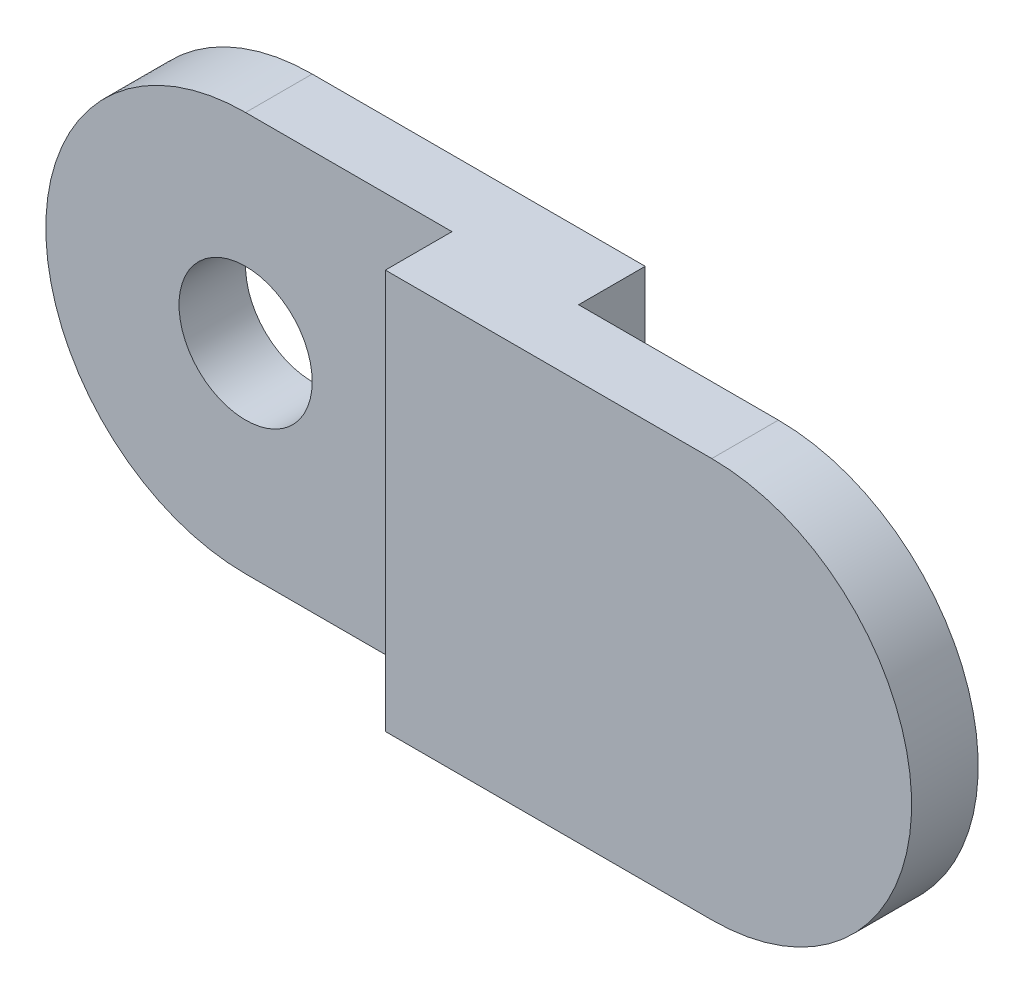
ISO-10303-21;
HEADER;
FILE_DESCRIPTION(('STEP AP214'),'2;1');
FILE_NAME('part.step','',(''),(''),'','','');
FILE_SCHEMA(('AUTOMOTIVE_DESIGN { 1 0 10303 214 1 1 1 1 }'));
ENDSEC;
DATA;
#1=APPLICATION_CONTEXT('core data for automotive mechanical design processes');
#2=APPLICATION_PROTOCOL_DEFINITION('international standard','automotive_design',2000,#1);
#3=PRODUCT_CONTEXT('',#1,'mechanical');
#4=PRODUCT('Part','Part','',(#3));
#5=PRODUCT_RELATED_PRODUCT_CATEGORY('part','',(#4));
#6=PRODUCT_DEFINITION_FORMATION('','',#4);
#7=PRODUCT_DEFINITION_CONTEXT('part definition',#1,'design');
#8=PRODUCT_DEFINITION('design','',#6,#7);
#9=PRODUCT_DEFINITION_SHAPE('','',#8);
#10=(LENGTH_UNIT() NAMED_UNIT(*) SI_UNIT(.MILLI.,.METRE.));
#11=(NAMED_UNIT(*) PLANE_ANGLE_UNIT() SI_UNIT($,.RADIAN.));
#12=(NAMED_UNIT(*) SI_UNIT($,.STERADIAN.) SOLID_ANGLE_UNIT());
#13=UNCERTAINTY_MEASURE_WITH_UNIT(LENGTH_MEASURE(1.E-05),#10,'distance_accuracy_value','');
#14=(GEOMETRIC_REPRESENTATION_CONTEXT(3) GLOBAL_UNCERTAINTY_ASSIGNED_CONTEXT((#13)) GLOBAL_UNIT_ASSIGNED_CONTEXT((#10,
#11,#12)) REPRESENTATION_CONTEXT('',''));
#15=CARTESIAN_POINT('',(0.,0.,0.));
#16=DIRECTION('',(0.,0.,1.));
#17=DIRECTION('',(1.,0.,0.));
#18=AXIS2_PLACEMENT_3D('',#15,#16,#17);
#19=CARTESIAN_POINT('',(20.,7.5,2.5));
#20=DIRECTION('',(0.,0.,-1.));
#21=DIRECTION('',(-1.,0.,0.));
#22=AXIS2_PLACEMENT_3D('',#19,#20,#21);
#23=PLANE('',#22);
#24=DIRECTION('',(0.,1.,0.));
#25=VECTOR('',#24,1.);
#26=CARTESIAN_POINT('',(12.5,15.,2.5));
#27=LINE('',#26,#25);
#28=CARTESIAN_POINT('',(12.5,0.,2.5));
#29=VERTEX_POINT('',#28);
#30=CARTESIAN_POINT('',(12.5,15.,2.5));
#31=VERTEX_POINT('',#30);
#32=EDGE_CURVE('E130',#29,#31,#27,.T.);
#33=ORIENTED_EDGE('',*,*,#32,.T.);
#34=DIRECTION('',(1.,0.,0.));
#35=VECTOR('',#34,1.);
#36=CARTESIAN_POINT('',(20.,15.,2.5));
#37=LINE('',#36,#35);
#38=CARTESIAN_POINT('',(20.,15.,2.5));
#39=VERTEX_POINT('',#38);
#40=EDGE_CURVE('E133',#31,#39,#37,.T.);
#41=ORIENTED_EDGE('',*,*,#40,.T.);
#42=CARTESIAN_POINT('',(20.,7.5,2.5));
#43=DIRECTION('',(0.,0.,-1.));
#44=DIRECTION('',(-1.,0.,0.));
#45=AXIS2_PLACEMENT_3D('',#42,#43,#44);
#46=CIRCLE('',#45,7.5);
#47=CARTESIAN_POINT('',(20.,0.,2.5));
#48=VERTEX_POINT('',#47);
#49=EDGE_CURVE('E135',#39,#48,#46,.T.);
#50=ORIENTED_EDGE('',*,*,#49,.T.);
#51=DIRECTION('',(-1.,0.,0.));
#52=VECTOR('',#51,1.);
#53=CARTESIAN_POINT('',(20.,0.,2.5));
#54=LINE('',#53,#52);
#55=EDGE_CURVE('E137',#48,#29,#54,.T.);
#56=ORIENTED_EDGE('',*,*,#55,.T.);
#57=EDGE_LOOP('',(#33,#41,#50,#56));
#58=FACE_BOUND('',#57,.T.);
#59=CARTESIAN_POINT('',(20.,7.5,2.5));
#60=DIRECTION('',(0.,0.,-1.));
#61=DIRECTION('',(-1.,0.,0.));
#62=AXIS2_PLACEMENT_3D('',#59,#60,#61);
#63=CIRCLE('',#62,2.5);
#64=CARTESIAN_POINT('',(17.5,7.5,2.5));
#65=VERTEX_POINT('',#64);
#66=EDGE_CURVE('E287',#65,#65,#63,.T.);
#67=ORIENTED_EDGE('',*,*,#66,.F.);
#68=EDGE_LOOP('',(#67));
#69=FACE_BOUND('',#68,.T.);
#70=ADVANCED_FACE('F37',(#58,#69),#23,.T.);
#71=CARTESIAN_POINT('',(0.,15.,5.));
#72=DIRECTION('',(0.,1.,0.));
#73=DIRECTION('',(-1.,0.,0.));
#74=AXIS2_PLACEMENT_3D('',#71,#72,#73);
#75=PLANE('',#74);
#76=DIRECTION('',(-1.,0.,0.));
#77=VECTOR('',#76,1.);
#78=CARTESIAN_POINT('',(0.,15.,2.5));
#79=LINE('',#78,#77);
#80=CARTESIAN_POINT('',(7.74683287137634,15.,2.5));
#81=VERTEX_POINT('',#80);
#82=CARTESIAN_POINT('',(0.,15.,2.5));
#83=VERTEX_POINT('',#82);
#84=EDGE_CURVE('E113',#81,#83,#79,.T.);
#85=ORIENTED_EDGE('',*,*,#84,.F.);
#86=DIRECTION('',(0.,0.,1.));
#87=VECTOR('',#86,1.);
#88=CARTESIAN_POINT('',(7.74683287137634,15.,2.5));
#89=LINE('',#88,#87);
#90=CARTESIAN_POINT('',(7.74683287137634,15.,5.));
#91=VERTEX_POINT('',#90);
#92=EDGE_CURVE('E100',#81,#91,#89,.T.);
#93=ORIENTED_EDGE('',*,*,#92,.T.);
#94=DIRECTION('',(1.,0.,0.));
#95=VECTOR('',#94,1.);
#96=CARTESIAN_POINT('',(0.,15.,5.));
#97=LINE('',#96,#95);
#98=CARTESIAN_POINT('',(20.,15.,5.));
#99=VERTEX_POINT('',#98);
#100=EDGE_CURVE('E149',#91,#99,#97,.T.);
#101=ORIENTED_EDGE('',*,*,#100,.T.);
#102=DIRECTION('',(0.,0.,-1.));
#103=VECTOR('',#102,1.);
#104=CARTESIAN_POINT('',(20.,15.,5.));
#105=LINE('',#104,#103);
#106=EDGE_CURVE('E11',#99,#39,#105,.T.);
#107=ORIENTED_EDGE('',*,*,#106,.T.);
#108=ORIENTED_EDGE('',*,*,#40,.F.);
#109=DIRECTION('',(0.,0.,-1.));
#110=VECTOR('',#109,1.);
#111=CARTESIAN_POINT('',(12.5,15.,2.5));
#112=LINE('',#111,#110);
#113=CARTESIAN_POINT('',(12.5,15.,0.));
#114=VERTEX_POINT('',#113);
#115=EDGE_CURVE('E140',#31,#114,#112,.T.);
#116=ORIENTED_EDGE('',*,*,#115,.T.);
#117=DIRECTION('',(1.,0.,0.));
#118=VECTOR('',#117,1.);
#119=CARTESIAN_POINT('',(0.,15.,0.));
#120=LINE('',#119,#118);
#121=CARTESIAN_POINT('',(0.,15.,0.));
#122=VERTEX_POINT('',#121);
#123=EDGE_CURVE('E143',#122,#114,#120,.T.);
#124=ORIENTED_EDGE('',*,*,#123,.F.);
#125=DIRECTION('',(0.,0.,-1.));
#126=VECTOR('',#125,1.);
#127=CARTESIAN_POINT('',(0.,15.,5.));
#128=LINE('',#127,#126);
#129=EDGE_CURVE('E45',#83,#122,#128,.T.);
#130=ORIENTED_EDGE('',*,*,#129,.F.);
#131=EDGE_LOOP('',(#85,#93,#101,#107,#108,#116,#124,#130));
#132=FACE_BOUND('',#131,.T.);
#133=ADVANCED_FACE('F118',(#132),#75,.T.);
#134=CARTESIAN_POINT('',(0.,7.50000000000001,5.));
#135=DIRECTION('',(0.,0.,-1.));
#136=DIRECTION('',(-1.,0.,0.));
#137=AXIS2_PLACEMENT_3D('',#134,#135,#136);
#138=CYLINDRICAL_SURFACE('',#137,7.50000000000001);
#139=CARTESIAN_POINT('',(0.,7.50000000000001,2.5));
#140=DIRECTION('',(0.,0.,1.));
#141=DIRECTION('',(1.,0.,0.));
#142=AXIS2_PLACEMENT_3D('',#139,#140,#141);
#143=CIRCLE('',#142,7.50000000000001);
#144=CARTESIAN_POINT('',(0.,0.,2.5));
#145=VERTEX_POINT('',#144);
#146=EDGE_CURVE('E120',#83,#145,#143,.T.);
#147=ORIENTED_EDGE('',*,*,#146,.F.);
#148=ORIENTED_EDGE('',*,*,#129,.T.);
#149=CARTESIAN_POINT('',(0.,7.50000000000001,0.));
#150=DIRECTION('',(0.,0.,1.));
#151=DIRECTION('',(1.,0.,0.));
#152=AXIS2_PLACEMENT_3D('',#149,#150,#151);
#153=CIRCLE('',#152,7.50000000000001);
#154=CARTESIAN_POINT('',(0.,0.,0.));
#155=VERTEX_POINT('',#154);
#156=EDGE_CURVE('E157',#122,#155,#153,.T.);
#157=ORIENTED_EDGE('',*,*,#156,.T.);
#158=DIRECTION('',(0.,0.,-1.));
#159=VECTOR('',#158,1.);
#160=CARTESIAN_POINT('',(0.,0.,5.));
#161=LINE('',#160,#159);
#162=EDGE_CURVE('E164',#145,#155,#161,.T.);
#163=ORIENTED_EDGE('',*,*,#162,.F.);
#164=EDGE_LOOP('',(#147,#148,#157,#163));
#165=FACE_BOUND('',#164,.T.);
#166=ADVANCED_FACE('F167',(#165),#138,.T.);
#167=CARTESIAN_POINT('',(0.,0.,5.));
#168=DIRECTION('',(0.,1.,0.));
#169=DIRECTION('',(0.,0.,1.));
#170=AXIS2_PLACEMENT_3D('',#167,#168,#169);
#171=PLANE('',#170);
#172=DIRECTION('',(0.,0.,1.));
#173=VECTOR('',#172,1.);
#174=CARTESIAN_POINT('',(7.74683287137634,0.,2.5));
#175=LINE('',#174,#173);
#176=CARTESIAN_POINT('',(7.74683287137634,0.,2.5));
#177=VERTEX_POINT('',#176);
#178=CARTESIAN_POINT('',(7.74683287137634,0.,5.));
#179=VERTEX_POINT('',#178);
#180=EDGE_CURVE('E52',#177,#179,#175,.T.);
#181=ORIENTED_EDGE('',*,*,#180,.F.);
#182=DIRECTION('',(1.,0.,0.));
#183=VECTOR('',#182,1.);
#184=CARTESIAN_POINT('',(0.,0.,2.5));
#185=LINE('',#184,#183);
#186=EDGE_CURVE('E109',#145,#177,#185,.T.);
#187=ORIENTED_EDGE('',*,*,#186,.F.);
#188=ORIENTED_EDGE('',*,*,#162,.T.);
#189=DIRECTION('',(1.,0.,0.));
#190=VECTOR('',#189,1.);
#191=CARTESIAN_POINT('',(0.,0.,0.));
#192=LINE('',#191,#190);
#193=CARTESIAN_POINT('',(12.5,0.,0.));
#194=VERTEX_POINT('',#193);
#195=EDGE_CURVE('E150',#155,#194,#192,.T.);
#196=ORIENTED_EDGE('',*,*,#195,.T.);
#197=DIRECTION('',(0.,0.,-1.));
#198=VECTOR('',#197,1.);
#199=CARTESIAN_POINT('',(12.5,0.,2.5));
#200=LINE('',#199,#198);
#201=EDGE_CURVE('E60',#29,#194,#200,.T.);
#202=ORIENTED_EDGE('',*,*,#201,.F.);
#203=ORIENTED_EDGE('',*,*,#55,.F.);
#204=DIRECTION('',(0.,0.,-1.));
#205=VECTOR('',#204,1.);
#206=CARTESIAN_POINT('',(20.,0.,5.));
#207=LINE('',#206,#205);
#208=CARTESIAN_POINT('',(20.,0.,5.));
#209=VERTEX_POINT('',#208);
#210=EDGE_CURVE('E154',#209,#48,#207,.T.);
#211=ORIENTED_EDGE('',*,*,#210,.F.);
#212=DIRECTION('',(1.,0.,0.));
#213=VECTOR('',#212,1.);
#214=CARTESIAN_POINT('',(0.,0.,5.));
#215=LINE('',#214,#213);
#216=EDGE_CURVE('E152',#179,#209,#215,.T.);
#217=ORIENTED_EDGE('',*,*,#216,.F.);
#218=EDGE_LOOP('',(#181,#187,#188,#196,#202,#203,#211,#217));
#219=FACE_BOUND('',#218,.T.);
#220=ADVANCED_FACE('F180',(#219),#171,.F.);
#221=CARTESIAN_POINT('',(0.,0.,5.));
#222=DIRECTION('',(0.,0.,1.));
#223=DIRECTION('',(1.,0.,0.));
#224=AXIS2_PLACEMENT_3D('',#221,#222,#223);
#225=PLANE('',#224);
#226=ORIENTED_EDGE('',*,*,#100,.F.);
#227=DIRECTION('',(0.,-1.,0.));
#228=VECTOR('',#227,1.);
#229=CARTESIAN_POINT('',(7.74683287137634,0.,5.));
#230=LINE('',#229,#228);
#231=EDGE_CURVE('E105',#91,#179,#230,.T.);
#232=ORIENTED_EDGE('',*,*,#231,.T.);
#233=ORIENTED_EDGE('',*,*,#216,.T.);
#234=CARTESIAN_POINT('',(20.,7.5,5.));
#235=DIRECTION('',(0.,0.,1.));
#236=DIRECTION('',(1.,0.,0.));
#237=AXIS2_PLACEMENT_3D('',#234,#235,#236);
#238=CIRCLE('',#237,7.5);
#239=EDGE_CURVE('E146',#99,#209,#238,.F.);
#240=ORIENTED_EDGE('',*,*,#239,.F.);
#241=EDGE_LOOP('',(#226,#232,#233,#240));
#242=FACE_BOUND('',#241,.T.);
#243=ADVANCED_FACE('F184',(#242),#225,.T.);
#244=CARTESIAN_POINT('',(20.,7.5,5.));
#245=DIRECTION('',(0.,0.,-1.));
#246=DIRECTION('',(-1.,0.,0.));
#247=AXIS2_PLACEMENT_3D('',#244,#245,#246);
#248=CYLINDRICAL_SURFACE('',#247,7.5);
#249=ORIENTED_EDGE('',*,*,#210,.T.);
#250=ORIENTED_EDGE('',*,*,#49,.F.);
#251=ORIENTED_EDGE('',*,*,#106,.F.);
#252=ORIENTED_EDGE('',*,*,#239,.T.);
#253=EDGE_LOOP('',(#249,#250,#251,#252));
#254=FACE_BOUND('',#253,.T.);
#255=ADVANCED_FACE('F39',(#254),#248,.T.);
#256=CARTESIAN_POINT('',(0.,0.,0.));
#257=DIRECTION('',(0.,0.,1.));
#258=DIRECTION('',(1.,0.,0.));
#259=AXIS2_PLACEMENT_3D('',#256,#257,#258);
#260=PLANE('',#259);
#261=CARTESIAN_POINT('',(0.,7.50000000000001,0.));
#262=DIRECTION('',(0.,0.,1.));
#263=DIRECTION('',(1.,0.,0.));
#264=AXIS2_PLACEMENT_3D('',#261,#262,#263);
#265=CIRCLE('',#264,2.5);
#266=CARTESIAN_POINT('',(2.5,7.50000000000001,0.));
#267=VERTEX_POINT('',#266);
#268=EDGE_CURVE('E127',#267,#267,#265,.T.);
#269=ORIENTED_EDGE('',*,*,#268,.T.);
#270=EDGE_LOOP('',(#269));
#271=FACE_BOUND('',#270,.T.);
#272=ORIENTED_EDGE('',*,*,#123,.T.);
#273=DIRECTION('',(0.,1.,0.));
#274=VECTOR('',#273,1.);
#275=CARTESIAN_POINT('',(12.5,15.,0.));
#276=LINE('',#275,#274);
#277=EDGE_CURVE('E128',#194,#114,#276,.T.);
#278=ORIENTED_EDGE('',*,*,#277,.F.);
#279=ORIENTED_EDGE('',*,*,#195,.F.);
#280=ORIENTED_EDGE('',*,*,#156,.F.);
#281=EDGE_LOOP('',(#272,#278,#279,#280));
#282=FACE_BOUND('',#281,.T.);
#283=ADVANCED_FACE('F171',(#271,#282),#260,.F.);
#284=CARTESIAN_POINT('',(12.5,15.,2.5));
#285=DIRECTION('',(-1.,0.,0.));
#286=DIRECTION('',(0.,-1.,0.));
#287=AXIS2_PLACEMENT_3D('',#284,#285,#286);
#288=PLANE('',#287);
#289=ORIENTED_EDGE('',*,*,#277,.T.);
#290=ORIENTED_EDGE('',*,*,#115,.F.);
#291=ORIENTED_EDGE('',*,*,#32,.F.);
#292=ORIENTED_EDGE('',*,*,#201,.T.);
#293=EDGE_LOOP('',(#289,#290,#291,#292));
#294=FACE_BOUND('',#293,.T.);
#295=ADVANCED_FACE('F173',(#294),#288,.F.);
#296=CARTESIAN_POINT('',(7.74683287137634,0.,2.5));
#297=DIRECTION('',(-1.,0.,0.));
#298=DIRECTION('',(0.,0.,1.));
#299=AXIS2_PLACEMENT_3D('',#296,#297,#298);
#300=PLANE('',#299);
#301=ORIENTED_EDGE('',*,*,#231,.F.);
#302=ORIENTED_EDGE('',*,*,#92,.F.);
#303=DIRECTION('',(0.,-1.,0.));
#304=VECTOR('',#303,1.);
#305=CARTESIAN_POINT('',(7.74683287137634,0.,2.5));
#306=LINE('',#305,#304);
#307=EDGE_CURVE('E103',#81,#177,#306,.T.);
#308=ORIENTED_EDGE('',*,*,#307,.T.);
#309=ORIENTED_EDGE('',*,*,#180,.T.);
#310=EDGE_LOOP('',(#301,#302,#308,#309));
#311=FACE_BOUND('',#310,.T.);
#312=ADVANCED_FACE('F102',(#311),#300,.T.);
#313=CARTESIAN_POINT('',(0.,0.,2.5));
#314=DIRECTION('',(0.,0.,1.));
#315=DIRECTION('',(1.,0.,0.));
#316=AXIS2_PLACEMENT_3D('',#313,#314,#315);
#317=PLANE('',#316);
#318=CARTESIAN_POINT('',(0.,7.50000000000001,2.5));
#319=DIRECTION('',(0.,0.,1.));
#320=DIRECTION('',(1.,0.,0.));
#321=AXIS2_PLACEMENT_3D('',#318,#319,#320);
#322=CIRCLE('',#321,2.5);
#323=CARTESIAN_POINT('',(2.5,7.50000000000001,2.5));
#324=VERTEX_POINT('',#323);
#325=EDGE_CURVE('E286',#324,#324,#322,.T.);
#326=ORIENTED_EDGE('',*,*,#325,.F.);
#327=EDGE_LOOP('',(#326));
#328=FACE_BOUND('',#327,.T.);
#329=ORIENTED_EDGE('',*,*,#307,.F.);
#330=ORIENTED_EDGE('',*,*,#84,.T.);
#331=ORIENTED_EDGE('',*,*,#146,.T.);
#332=ORIENTED_EDGE('',*,*,#186,.T.);
#333=EDGE_LOOP('',(#329,#330,#331,#332));
#334=FACE_BOUND('',#333,.T.);
#335=ADVANCED_FACE('F112',(#328,#334),#317,.T.);
#336=CARTESIAN_POINT('',(0.,7.50000000000001,0.));
#337=DIRECTION('',(0.,0.,1.));
#338=DIRECTION('',(1.,0.,0.));
#339=AXIS2_PLACEMENT_3D('',#336,#337,#338);
#340=CYLINDRICAL_SURFACE('',#339,2.5);
#341=ORIENTED_EDGE('',*,*,#268,.F.);
#342=EDGE_LOOP('',(#341));
#343=FACE_BOUND('',#342,.T.);
#344=ORIENTED_EDGE('',*,*,#325,.T.);
#345=EDGE_LOOP('',(#344));
#346=FACE_BOUND('',#345,.T.);
#347=ADVANCED_FACE('F246',(#343,#346),#340,.F.);
#348=CARTESIAN_POINT('',(20.,7.5,0.));
#349=DIRECTION('',(0.,0.,1.));
#350=DIRECTION('',(1.,0.,0.));
#351=AXIS2_PLACEMENT_3D('',#348,#349,#350);
#352=CYLINDRICAL_SURFACE('',#351,2.5);
#353=CARTESIAN_POINT('',(20.,7.5,0.));
#354=DIRECTION('',(0.,0.,-1.));
#355=DIRECTION('',(-1.,0.,0.));
#356=AXIS2_PLACEMENT_3D('',#353,#354,#355);
#357=CIRCLE('',#356,2.5);
#358=CARTESIAN_POINT('',(17.5,7.5,0.));
#359=VERTEX_POINT('',#358);
#360=EDGE_CURVE('E285',#359,#359,#357,.T.);
#361=ORIENTED_EDGE('',*,*,#360,.F.);
#362=EDGE_LOOP('',(#361));
#363=FACE_BOUND('',#362,.T.);
#364=ORIENTED_EDGE('',*,*,#66,.T.);
#365=EDGE_LOOP('',(#364));
#366=FACE_BOUND('',#365,.T.);
#367=ADVANCED_FACE('F254',(#363,#366),#352,.T.);
#368=CARTESIAN_POINT('',(20.,7.5,0.));
#369=DIRECTION('',(0.,0.,-1.));
#370=DIRECTION('',(-1.,0.,0.));
#371=AXIS2_PLACEMENT_3D('',#368,#369,#370);
#372=PLANE('',#371);
#373=ORIENTED_EDGE('',*,*,#360,.T.);
#374=EDGE_LOOP('',(#373));
#375=FACE_BOUND('',#374,.T.);
#376=ADVANCED_FACE('F269',(#375),#372,.T.);
#377=CLOSED_SHELL('',(#70,#133,#166,#220,#243,#255,#283,#295,#312,#335,#347,#367,#376));
#378=MANIFOLD_SOLID_BREP('B2',#377);
#379=ADVANCED_BREP_SHAPE_REPRESENTATION('',(#18,#378),#14);
#380=SHAPE_DEFINITION_REPRESENTATION(#9,#379);
ENDSEC;
END-ISO-10303-21;
